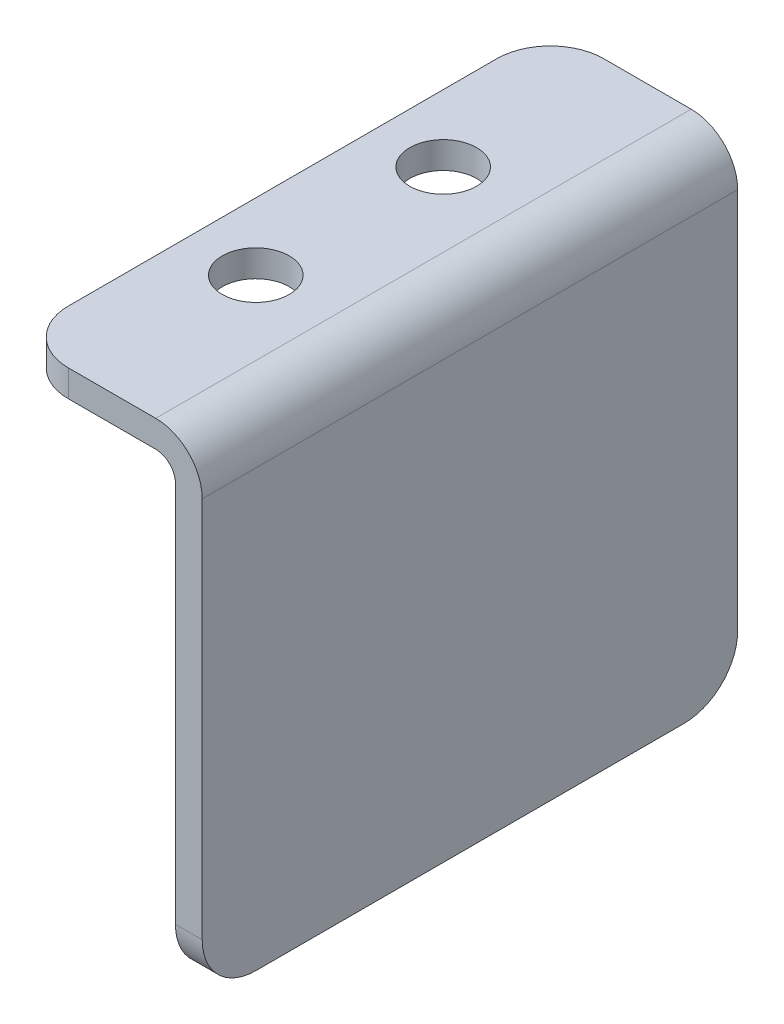
ISO-10303-21;
HEADER;
FILE_DESCRIPTION(('STEP AP214'),'2;1');
FILE_NAME('part.step','',(''),(''),'','','');
FILE_SCHEMA(('AUTOMOTIVE_DESIGN { 1 0 10303 214 1 1 1 1 }'));
ENDSEC;
DATA;
#1=APPLICATION_CONTEXT('core data for automotive mechanical design processes');
#2=APPLICATION_PROTOCOL_DEFINITION('international standard','automotive_design',2000,#1);
#3=PRODUCT_CONTEXT('',#1,'mechanical');
#4=PRODUCT('Part','Part','',(#3));
#5=PRODUCT_RELATED_PRODUCT_CATEGORY('part','',(#4));
#6=PRODUCT_DEFINITION_FORMATION('','',#4);
#7=PRODUCT_DEFINITION_CONTEXT('part definition',#1,'design');
#8=PRODUCT_DEFINITION('design','',#6,#7);
#9=PRODUCT_DEFINITION_SHAPE('','',#8);
#10=(LENGTH_UNIT() NAMED_UNIT(*) SI_UNIT(.MILLI.,.METRE.));
#11=(NAMED_UNIT(*) PLANE_ANGLE_UNIT() SI_UNIT($,.RADIAN.));
#12=(NAMED_UNIT(*) SI_UNIT($,.STERADIAN.) SOLID_ANGLE_UNIT());
#13=UNCERTAINTY_MEASURE_WITH_UNIT(LENGTH_MEASURE(1.E-05),#10,'distance_accuracy_value','');
#14=(GEOMETRIC_REPRESENTATION_CONTEXT(3) GLOBAL_UNCERTAINTY_ASSIGNED_CONTEXT((#13)) GLOBAL_UNIT_ASSIGNED_CONTEXT((#10,
#11,#12)) REPRESENTATION_CONTEXT('',''));
#15=CARTESIAN_POINT('',(0.,0.,0.));
#16=DIRECTION('',(0.,0.,1.));
#17=DIRECTION('',(1.,0.,0.));
#18=AXIS2_PLACEMENT_3D('',#15,#16,#17);
#19=CARTESIAN_POINT('',(2.,1.,-2.));
#20=DIRECTION('',(0.,-1.,0.));
#21=DIRECTION('',(0.,0.,-1.));
#22=AXIS2_PLACEMENT_3D('',#19,#20,#21);
#23=CYLINDRICAL_SURFACE('',#22,2.);
#24=CARTESIAN_POINT('',(2.,1.,-2.));
#25=DIRECTION('',(0.,-1.,0.));
#26=DIRECTION('',(0.,0.,-1.));
#27=AXIS2_PLACEMENT_3D('',#24,#25,#26);
#28=CIRCLE('',#27,2.);
#29=CARTESIAN_POINT('',(2.,1.,0.));
#30=VERTEX_POINT('',#29);
#31=CARTESIAN_POINT('',(0.,1.,-2.));
#32=VERTEX_POINT('',#31);
#33=EDGE_CURVE('E20',#30,#32,#28,.T.);
#34=ORIENTED_EDGE('',*,*,#33,.T.);
#35=DIRECTION('',(0.,-1.,0.));
#36=VECTOR('',#35,1.);
#37=CARTESIAN_POINT('',(0.,1.,-2.));
#38=LINE('',#37,#36);
#39=CARTESIAN_POINT('',(0.,0.,-2.));
#40=VERTEX_POINT('',#39);
#41=EDGE_CURVE('E11',#32,#40,#38,.T.);
#42=ORIENTED_EDGE('',*,*,#41,.T.);
#43=CARTESIAN_POINT('',(2.,0.,-2.));
#44=DIRECTION('',(0.,-1.,0.));
#45=DIRECTION('',(0.,0.,-1.));
#46=AXIS2_PLACEMENT_3D('',#43,#44,#45);
#47=CIRCLE('',#46,2.);
#48=CARTESIAN_POINT('',(2.,0.,0.));
#49=VERTEX_POINT('',#48);
#50=EDGE_CURVE('E274',#49,#40,#47,.T.);
#51=ORIENTED_EDGE('',*,*,#50,.F.);
#52=DIRECTION('',(0.,1.,0.));
#53=VECTOR('',#52,1.);
#54=CARTESIAN_POINT('',(2.,1.,0.));
#55=LINE('',#54,#53);
#56=EDGE_CURVE('E250',#49,#30,#55,.T.);
#57=ORIENTED_EDGE('',*,*,#56,.T.);
#58=EDGE_LOOP('',(#34,#42,#51,#57));
#59=FACE_BOUND('',#58,.T.);
#60=ADVANCED_FACE('F17',(#59),#23,.T.);
#61=CARTESIAN_POINT('',(0.,1.,0.));
#62=DIRECTION('',(1.,0.,0.));
#63=DIRECTION('',(0.,1.,0.));
#64=AXIS2_PLACEMENT_3D('',#61,#62,#63);
#65=PLANE('',#64);
#66=DIRECTION('',(0.,0.,-1.));
#67=VECTOR('',#66,1.);
#68=CARTESIAN_POINT('',(0.,0.,-20.));
#69=LINE('',#68,#67);
#70=CARTESIAN_POINT('',(0.,0.,-18.));
#71=VERTEX_POINT('',#70);
#72=EDGE_CURVE('E278',#40,#71,#69,.T.);
#73=ORIENTED_EDGE('',*,*,#72,.F.);
#74=ORIENTED_EDGE('',*,*,#41,.F.);
#75=DIRECTION('',(0.,0.,-1.));
#76=VECTOR('',#75,1.);
#77=CARTESIAN_POINT('',(0.,1.,-20.));
#78=LINE('',#77,#76);
#79=CARTESIAN_POINT('',(0.,1.,-18.));
#80=VERTEX_POINT('',#79);
#81=EDGE_CURVE('E285',#32,#80,#78,.T.);
#82=ORIENTED_EDGE('',*,*,#81,.T.);
#83=DIRECTION('',(0.,1.,0.));
#84=VECTOR('',#83,1.);
#85=CARTESIAN_POINT('',(0.,1.,-18.));
#86=LINE('',#85,#84);
#87=EDGE_CURVE('E26',#71,#80,#86,.T.);
#88=ORIENTED_EDGE('',*,*,#87,.F.);
#89=EDGE_LOOP('',(#73,#74,#82,#88));
#90=FACE_BOUND('',#89,.T.);
#91=ADVANCED_FACE('F310',(#90),#65,.F.);
#92=CARTESIAN_POINT('',(2.,1.,-18.));
#93=DIRECTION('',(0.,-1.,0.));
#94=DIRECTION('',(0.,0.,-1.));
#95=AXIS2_PLACEMENT_3D('',#92,#93,#94);
#96=CYLINDRICAL_SURFACE('',#95,2.);
#97=CARTESIAN_POINT('',(2.,1.,-18.));
#98=DIRECTION('',(0.,-1.,0.));
#99=DIRECTION('',(0.,0.,-1.));
#100=AXIS2_PLACEMENT_3D('',#97,#98,#99);
#101=CIRCLE('',#100,2.);
#102=CARTESIAN_POINT('',(2.,1.,-20.));
#103=VERTEX_POINT('',#102);
#104=EDGE_CURVE('E269',#80,#103,#101,.T.);
#105=ORIENTED_EDGE('',*,*,#104,.T.);
#106=DIRECTION('',(0.,-1.,0.));
#107=VECTOR('',#106,1.);
#108=CARTESIAN_POINT('',(2.,1.,-20.));
#109=LINE('',#108,#107);
#110=CARTESIAN_POINT('',(2.,0.,-20.));
#111=VERTEX_POINT('',#110);
#112=EDGE_CURVE('E203',#103,#111,#109,.T.);
#113=ORIENTED_EDGE('',*,*,#112,.T.);
#114=CARTESIAN_POINT('',(2.,0.,-18.));
#115=DIRECTION('',(0.,-1.,0.));
#116=DIRECTION('',(0.,0.,-1.));
#117=AXIS2_PLACEMENT_3D('',#114,#115,#116);
#118=CIRCLE('',#117,2.);
#119=EDGE_CURVE('E282',#71,#111,#118,.T.);
#120=ORIENTED_EDGE('',*,*,#119,.F.);
#121=ORIENTED_EDGE('',*,*,#87,.T.);
#122=EDGE_LOOP('',(#105,#113,#120,#121));
#123=FACE_BOUND('',#122,.T.);
#124=ADVANCED_FACE('F301',(#123),#96,.T.);
#125=CARTESIAN_POINT('',(5.2634,-0.7366,0.));
#126=DIRECTION('',(0.,0.,1.));
#127=DIRECTION('',(1.,0.,0.));
#128=AXIS2_PLACEMENT_3D('',#125,#126,#127);
#129=CYLINDRICAL_SURFACE('',#128,0.7366);
#130=DIRECTION('',(0.,0.,-1.));
#131=VECTOR('',#130,1.);
#132=CARTESIAN_POINT('',(6.,-0.7366,0.));
#133=LINE('',#132,#131);
#134=CARTESIAN_POINT('',(6.,-0.7366,0.));
#135=VERTEX_POINT('',#134);
#136=CARTESIAN_POINT('',(6.,-0.7366,-20.));
#137=VERTEX_POINT('',#136);
#138=EDGE_CURVE('E265',#135,#137,#133,.T.);
#139=ORIENTED_EDGE('',*,*,#138,.F.);
#140=CARTESIAN_POINT('',(5.2634,-0.7366,0.));
#141=DIRECTION('',(0.,0.,-1.));
#142=DIRECTION('',(1.,0.,0.));
#143=AXIS2_PLACEMENT_3D('',#140,#141,#142);
#144=CIRCLE('',#143,0.7366);
#145=CARTESIAN_POINT('',(5.2634,0.,0.));
#146=VERTEX_POINT('',#145);
#147=EDGE_CURVE('E258',#146,#135,#144,.T.);
#148=ORIENTED_EDGE('',*,*,#147,.F.);
#149=DIRECTION('',(0.,0.,1.));
#150=VECTOR('',#149,1.);
#151=CARTESIAN_POINT('',(5.2634,0.,-20.));
#152=LINE('',#151,#150);
#153=CARTESIAN_POINT('',(5.2634,0.,-20.));
#154=VERTEX_POINT('',#153);
#155=EDGE_CURVE('E268',#154,#146,#152,.T.);
#156=ORIENTED_EDGE('',*,*,#155,.F.);
#157=CARTESIAN_POINT('',(5.2634,-0.7366,-20.));
#158=DIRECTION('',(0.,0.,1.));
#159=DIRECTION('',(1.,0.,0.));
#160=AXIS2_PLACEMENT_3D('',#157,#158,#159);
#161=CIRCLE('',#160,0.7366);
#162=EDGE_CURVE('E204',#137,#154,#161,.T.);
#163=ORIENTED_EDGE('',*,*,#162,.F.);
#164=EDGE_LOOP('',(#139,#148,#156,#163));
#165=FACE_BOUND('',#164,.T.);
#166=ADVANCED_FACE('F318',(#165),#129,.F.);
#167=CARTESIAN_POINT('',(0.,1.,-20.));
#168=DIRECTION('',(0.,-1.,0.));
#169=DIRECTION('',(0.,0.,-1.));
#170=AXIS2_PLACEMENT_3D('',#167,#168,#169);
#171=PLANE('',#170);
#172=CARTESIAN_POINT('',(2.5,1.,-13.5));
#173=DIRECTION('',(0.,1.,0.));
#174=DIRECTION('',(0.,0.,1.));
#175=AXIS2_PLACEMENT_3D('',#172,#173,#174);
#176=CIRCLE('',#175,1.25);
#177=CARTESIAN_POINT('',(2.5,1.,-12.25));
#178=VERTEX_POINT('',#177);
#179=EDGE_CURVE('E174',#178,#178,#176,.T.);
#180=ORIENTED_EDGE('',*,*,#179,.F.);
#181=EDGE_LOOP('',(#180));
#182=FACE_BOUND('',#181,.T.);
#183=CARTESIAN_POINT('',(2.5,1.,-6.5));
#184=DIRECTION('',(0.,1.,0.));
#185=DIRECTION('',(0.,0.,1.));
#186=AXIS2_PLACEMENT_3D('',#183,#184,#185);
#187=CIRCLE('',#186,1.25);
#188=CARTESIAN_POINT('',(2.5,1.,-5.25));
#189=VERTEX_POINT('',#188);
#190=EDGE_CURVE('E188',#189,#189,#187,.T.);
#191=ORIENTED_EDGE('',*,*,#190,.F.);
#192=EDGE_LOOP('',(#191));
#193=FACE_BOUND('',#192,.T.);
#194=ORIENTED_EDGE('',*,*,#81,.F.);
#195=ORIENTED_EDGE('',*,*,#33,.F.);
#196=DIRECTION('',(1.,0.,0.));
#197=VECTOR('',#196,1.);
#198=CARTESIAN_POINT('',(7.,1.,0.));
#199=LINE('',#198,#197);
#200=CARTESIAN_POINT('',(5.2634,1.,0.));
#201=VERTEX_POINT('',#200);
#202=EDGE_CURVE('E247',#30,#201,#199,.T.);
#203=ORIENTED_EDGE('',*,*,#202,.T.);
#204=DIRECTION('',(0.,0.,1.));
#205=VECTOR('',#204,1.);
#206=CARTESIAN_POINT('',(5.2634,1.,0.));
#207=LINE('',#206,#205);
#208=CARTESIAN_POINT('',(5.2634,1.,-20.));
#209=VERTEX_POINT('',#208);
#210=EDGE_CURVE('E240',#209,#201,#207,.T.);
#211=ORIENTED_EDGE('',*,*,#210,.F.);
#212=DIRECTION('',(-1.,0.,0.));
#213=VECTOR('',#212,1.);
#214=CARTESIAN_POINT('',(7.,1.,-20.));
#215=LINE('',#214,#213);
#216=EDGE_CURVE('E232',#209,#103,#215,.T.);
#217=ORIENTED_EDGE('',*,*,#216,.T.);
#218=ORIENTED_EDGE('',*,*,#104,.F.);
#219=EDGE_LOOP('',(#194,#195,#203,#211,#217,#218));
#220=FACE_BOUND('',#219,.T.);
#221=ADVANCED_FACE('F298',(#182,#193,#220),#171,.F.);
#222=CARTESIAN_POINT('',(0.,0.,-20.));
#223=DIRECTION('',(0.,-1.,0.));
#224=DIRECTION('',(0.,0.,-1.));
#225=AXIS2_PLACEMENT_3D('',#222,#223,#224);
#226=PLANE('',#225);
#227=CARTESIAN_POINT('',(2.5,0.,-13.5));
#228=DIRECTION('',(0.,1.,0.));
#229=DIRECTION('',(0.,0.,1.));
#230=AXIS2_PLACEMENT_3D('',#227,#228,#229);
#231=CIRCLE('',#230,1.25);
#232=CARTESIAN_POINT('',(2.5,0.,-12.25));
#233=VERTEX_POINT('',#232);
#234=EDGE_CURVE('E178',#233,#233,#231,.T.);
#235=ORIENTED_EDGE('',*,*,#234,.T.);
#236=EDGE_LOOP('',(#235));
#237=FACE_BOUND('',#236,.T.);
#238=CARTESIAN_POINT('',(2.5,0.,-6.5));
#239=DIRECTION('',(0.,1.,0.));
#240=DIRECTION('',(0.,0.,1.));
#241=AXIS2_PLACEMENT_3D('',#238,#239,#240);
#242=CIRCLE('',#241,1.25);
#243=CARTESIAN_POINT('',(2.5,0.,-5.25));
#244=VERTEX_POINT('',#243);
#245=EDGE_CURVE('E185',#244,#244,#242,.T.);
#246=ORIENTED_EDGE('',*,*,#245,.T.);
#247=EDGE_LOOP('',(#246));
#248=FACE_BOUND('',#247,.T.);
#249=DIRECTION('',(1.,0.,0.));
#250=VECTOR('',#249,1.);
#251=CARTESIAN_POINT('',(7.,0.,-20.));
#252=LINE('',#251,#250);
#253=EDGE_CURVE('E199',#111,#154,#252,.T.);
#254=ORIENTED_EDGE('',*,*,#253,.T.);
#255=ORIENTED_EDGE('',*,*,#155,.T.);
#256=DIRECTION('',(-1.,0.,0.));
#257=VECTOR('',#256,1.);
#258=CARTESIAN_POINT('',(7.,0.,0.));
#259=LINE('',#258,#257);
#260=EDGE_CURVE('E254',#146,#49,#259,.T.);
#261=ORIENTED_EDGE('',*,*,#260,.T.);
#262=ORIENTED_EDGE('',*,*,#50,.T.);
#263=ORIENTED_EDGE('',*,*,#72,.T.);
#264=ORIENTED_EDGE('',*,*,#119,.T.);
#265=EDGE_LOOP('',(#254,#255,#261,#262,#263,#264));
#266=FACE_BOUND('',#265,.T.);
#267=ADVANCED_FACE('F308',(#237,#248,#266),#226,.T.);
#268=CARTESIAN_POINT('',(6.,0.,0.));
#269=DIRECTION('',(-1.,0.,0.));
#270=DIRECTION('',(0.,1.,0.));
#271=AXIS2_PLACEMENT_3D('',#268,#269,#270);
#272=PLANE('',#271);
#273=DIRECTION('',(0.,1.,0.));
#274=VECTOR('',#273,1.);
#275=CARTESIAN_POINT('',(6.,-17.,0.));
#276=LINE('',#275,#274);
#277=CARTESIAN_POINT('',(6.,-15.,0.));
#278=VERTEX_POINT('',#277);
#279=EDGE_CURVE('E262',#278,#135,#276,.T.);
#280=ORIENTED_EDGE('',*,*,#279,.T.);
#281=ORIENTED_EDGE('',*,*,#138,.T.);
#282=DIRECTION('',(0.,-1.,0.));
#283=VECTOR('',#282,1.);
#284=CARTESIAN_POINT('',(6.,0.,-20.));
#285=LINE('',#284,#283);
#286=CARTESIAN_POINT('',(6.,-15.,-20.));
#287=VERTEX_POINT('',#286);
#288=EDGE_CURVE('E218',#137,#287,#285,.T.);
#289=ORIENTED_EDGE('',*,*,#288,.T.);
#290=CARTESIAN_POINT('',(6.,-15.,-18.));
#291=DIRECTION('',(1.,0.,0.));
#292=DIRECTION('',(0.,-1.,0.));
#293=AXIS2_PLACEMENT_3D('',#290,#291,#292);
#294=CIRCLE('',#293,2.);
#295=CARTESIAN_POINT('',(6.,-17.,-18.));
#296=VERTEX_POINT('',#295);
#297=EDGE_CURVE('E147',#296,#287,#294,.T.);
#298=ORIENTED_EDGE('',*,*,#297,.F.);
#299=DIRECTION('',(0.,0.,1.));
#300=VECTOR('',#299,1.);
#301=CARTESIAN_POINT('',(6.,-17.,-20.));
#302=LINE('',#301,#300);
#303=CARTESIAN_POINT('',(6.,-17.,-2.));
#304=VERTEX_POINT('',#303);
#305=EDGE_CURVE('E139',#296,#304,#302,.T.);
#306=ORIENTED_EDGE('',*,*,#305,.T.);
#307=CARTESIAN_POINT('',(6.,-15.,-2.));
#308=DIRECTION('',(1.,0.,0.));
#309=DIRECTION('',(0.,-1.,0.));
#310=AXIS2_PLACEMENT_3D('',#307,#308,#309);
#311=CIRCLE('',#310,2.);
#312=EDGE_CURVE('E144',#278,#304,#311,.T.);
#313=ORIENTED_EDGE('',*,*,#312,.F.);
#314=EDGE_LOOP('',(#280,#281,#289,#298,#306,#313));
#315=FACE_BOUND('',#314,.T.);
#316=ADVANCED_FACE('F142',(#315),#272,.T.);
#317=CARTESIAN_POINT('',(7.,-17.,0.));
#318=DIRECTION('',(0.,0.,-1.));
#319=DIRECTION('',(0.,-1.,0.));
#320=AXIS2_PLACEMENT_3D('',#317,#318,#319);
#321=PLANE('',#320);
#322=DIRECTION('',(0.,1.,0.));
#323=VECTOR('',#322,1.);
#324=CARTESIAN_POINT('',(7.,0.,0.));
#325=LINE('',#324,#323);
#326=CARTESIAN_POINT('',(7.,-15.,0.));
#327=VERTEX_POINT('',#326);
#328=CARTESIAN_POINT('',(7.,-0.7366,0.));
#329=VERTEX_POINT('',#328);
#330=EDGE_CURVE('E195',#327,#329,#325,.T.);
#331=ORIENTED_EDGE('',*,*,#330,.T.);
#332=CARTESIAN_POINT('',(5.2634,-0.7366,0.));
#333=DIRECTION('',(0.,0.,-1.));
#334=DIRECTION('',(1.,0.,0.));
#335=AXIS2_PLACEMENT_3D('',#332,#333,#334);
#336=CIRCLE('',#335,1.7366);
#337=EDGE_CURVE('E244',#201,#329,#336,.T.);
#338=ORIENTED_EDGE('',*,*,#337,.F.);
#339=ORIENTED_EDGE('',*,*,#202,.F.);
#340=ORIENTED_EDGE('',*,*,#56,.F.);
#341=ORIENTED_EDGE('',*,*,#260,.F.);
#342=ORIENTED_EDGE('',*,*,#147,.T.);
#343=ORIENTED_EDGE('',*,*,#279,.F.);
#344=DIRECTION('',(-1.,0.,0.));
#345=VECTOR('',#344,1.);
#346=CARTESIAN_POINT('',(7.,-15.,0.));
#347=LINE('',#346,#345);
#348=EDGE_CURVE('E164',#327,#278,#347,.T.);
#349=ORIENTED_EDGE('',*,*,#348,.F.);
#350=EDGE_LOOP('',(#331,#338,#339,#340,#341,#342,#343,#349));
#351=FACE_BOUND('',#350,.T.);
#352=ADVANCED_FACE('F333',(#351),#321,.F.);
#353=CARTESIAN_POINT('',(5.2634,-0.7366,0.));
#354=DIRECTION('',(0.,0.,1.));
#355=DIRECTION('',(1.,0.,0.));
#356=AXIS2_PLACEMENT_3D('',#353,#354,#355);
#357=CYLINDRICAL_SURFACE('',#356,1.7366);
#358=ORIENTED_EDGE('',*,*,#210,.T.);
#359=ORIENTED_EDGE('',*,*,#337,.T.);
#360=DIRECTION('',(0.,0.,-1.));
#361=VECTOR('',#360,1.);
#362=CARTESIAN_POINT('',(7.,-0.7366,0.));
#363=LINE('',#362,#361);
#364=CARTESIAN_POINT('',(7.,-0.7366,-20.));
#365=VERTEX_POINT('',#364);
#366=EDGE_CURVE('E183',#329,#365,#363,.T.);
#367=ORIENTED_EDGE('',*,*,#366,.T.);
#368=CARTESIAN_POINT('',(5.2634,-0.7366,-20.));
#369=DIRECTION('',(0.,0.,1.));
#370=DIRECTION('',(1.,0.,0.));
#371=AXIS2_PLACEMENT_3D('',#368,#369,#370);
#372=CIRCLE('',#371,1.7366);
#373=EDGE_CURVE('E236',#365,#209,#372,.T.);
#374=ORIENTED_EDGE('',*,*,#373,.T.);
#375=EDGE_LOOP('',(#358,#359,#367,#374));
#376=FACE_BOUND('',#375,.T.);
#377=ADVANCED_FACE('F330',(#376),#357,.T.);
#378=CARTESIAN_POINT('',(7.,0.,-20.));
#379=DIRECTION('',(0.,0.,1.));
#380=DIRECTION('',(1.,0.,0.));
#381=AXIS2_PLACEMENT_3D('',#378,#379,#380);
#382=PLANE('',#381);
#383=ORIENTED_EDGE('',*,*,#288,.F.);
#384=ORIENTED_EDGE('',*,*,#162,.T.);
#385=ORIENTED_EDGE('',*,*,#253,.F.);
#386=ORIENTED_EDGE('',*,*,#112,.F.);
#387=ORIENTED_EDGE('',*,*,#216,.F.);
#388=ORIENTED_EDGE('',*,*,#373,.F.);
#389=DIRECTION('',(0.,-1.,0.));
#390=VECTOR('',#389,1.);
#391=CARTESIAN_POINT('',(7.,0.,-20.));
#392=LINE('',#391,#390);
#393=CARTESIAN_POINT('',(7.,-15.,-20.));
#394=VERTEX_POINT('',#393);
#395=EDGE_CURVE('E179',#365,#394,#392,.T.);
#396=ORIENTED_EDGE('',*,*,#395,.T.);
#397=DIRECTION('',(1.,0.,0.));
#398=VECTOR('',#397,1.);
#399=CARTESIAN_POINT('',(7.,-15.,-20.));
#400=LINE('',#399,#398);
#401=EDGE_CURVE('E192',#287,#394,#400,.T.);
#402=ORIENTED_EDGE('',*,*,#401,.F.);
#403=EDGE_LOOP('',(#383,#384,#385,#386,#387,#388,#396,#402));
#404=FACE_BOUND('',#403,.T.);
#405=ADVANCED_FACE('F305',(#404),#382,.F.);
#406=CARTESIAN_POINT('',(7.,-15.,-18.));
#407=DIRECTION('',(-1.,0.,0.));
#408=DIRECTION('',(0.,-1.,0.));
#409=AXIS2_PLACEMENT_3D('',#406,#407,#408);
#410=CYLINDRICAL_SURFACE('',#409,2.);
#411=CARTESIAN_POINT('',(7.,-15.,-18.));
#412=DIRECTION('',(-1.,0.,0.));
#413=DIRECTION('',(0.,-1.,0.));
#414=AXIS2_PLACEMENT_3D('',#411,#412,#413);
#415=CIRCLE('',#414,2.);
#416=CARTESIAN_POINT('',(7.,-17.,-18.));
#417=VERTEX_POINT('',#416);
#418=EDGE_CURVE('E184',#394,#417,#415,.T.);
#419=ORIENTED_EDGE('',*,*,#418,.T.);
#420=DIRECTION('',(-1.,0.,0.));
#421=VECTOR('',#420,1.);
#422=CARTESIAN_POINT('',(7.,-17.,-18.));
#423=LINE('',#422,#421);
#424=EDGE_CURVE('E151',#417,#296,#423,.T.);
#425=ORIENTED_EDGE('',*,*,#424,.T.);
#426=ORIENTED_EDGE('',*,*,#297,.T.);
#427=ORIENTED_EDGE('',*,*,#401,.T.);
#428=EDGE_LOOP('',(#419,#425,#426,#427));
#429=FACE_BOUND('',#428,.T.);
#430=ADVANCED_FACE('F337',(#429),#410,.T.);
#431=CARTESIAN_POINT('',(7.,-17.,-20.));
#432=DIRECTION('',(0.,1.,0.));
#433=DIRECTION('',(1.,0.,0.));
#434=AXIS2_PLACEMENT_3D('',#431,#432,#433);
#435=PLANE('',#434);
#436=ORIENTED_EDGE('',*,*,#305,.F.);
#437=ORIENTED_EDGE('',*,*,#424,.F.);
#438=DIRECTION('',(0.,0.,1.));
#439=VECTOR('',#438,1.);
#440=CARTESIAN_POINT('',(7.,-17.,0.));
#441=LINE('',#440,#439);
#442=CARTESIAN_POINT('',(7.,-17.,-2.));
#443=VERTEX_POINT('',#442);
#444=EDGE_CURVE('E157',#417,#443,#441,.T.);
#445=ORIENTED_EDGE('',*,*,#444,.T.);
#446=DIRECTION('',(1.,0.,0.));
#447=VECTOR('',#446,1.);
#448=CARTESIAN_POINT('',(7.,-17.,-2.));
#449=LINE('',#448,#447);
#450=EDGE_CURVE('E152',#304,#443,#449,.T.);
#451=ORIENTED_EDGE('',*,*,#450,.F.);
#452=EDGE_LOOP('',(#436,#437,#445,#451));
#453=FACE_BOUND('',#452,.T.);
#454=ADVANCED_FACE('F155',(#453),#435,.F.);
#455=CARTESIAN_POINT('',(7.,-15.,-2.));
#456=DIRECTION('',(-1.,0.,0.));
#457=DIRECTION('',(0.,-1.,0.));
#458=AXIS2_PLACEMENT_3D('',#455,#456,#457);
#459=CYLINDRICAL_SURFACE('',#458,2.);
#460=CARTESIAN_POINT('',(7.,-15.,-2.));
#461=DIRECTION('',(-1.,0.,0.));
#462=DIRECTION('',(0.,-1.,0.));
#463=AXIS2_PLACEMENT_3D('',#460,#461,#462);
#464=CIRCLE('',#463,2.);
#465=EDGE_CURVE('E171',#443,#327,#464,.T.);
#466=ORIENTED_EDGE('',*,*,#465,.T.);
#467=ORIENTED_EDGE('',*,*,#348,.T.);
#468=ORIENTED_EDGE('',*,*,#312,.T.);
#469=ORIENTED_EDGE('',*,*,#450,.T.);
#470=EDGE_LOOP('',(#466,#467,#468,#469));
#471=FACE_BOUND('',#470,.T.);
#472=ADVANCED_FACE('F163',(#471),#459,.T.);
#473=CARTESIAN_POINT('',(7.,0.,0.));
#474=DIRECTION('',(-1.,0.,0.));
#475=DIRECTION('',(0.,1.,0.));
#476=AXIS2_PLACEMENT_3D('',#473,#474,#475);
#477=PLANE('',#476);
#478=ORIENTED_EDGE('',*,*,#444,.F.);
#479=ORIENTED_EDGE('',*,*,#418,.F.);
#480=ORIENTED_EDGE('',*,*,#395,.F.);
#481=ORIENTED_EDGE('',*,*,#366,.F.);
#482=ORIENTED_EDGE('',*,*,#330,.F.);
#483=ORIENTED_EDGE('',*,*,#465,.F.);
#484=EDGE_LOOP('',(#478,#479,#480,#481,#482,#483));
#485=FACE_BOUND('',#484,.T.);
#486=ADVANCED_FACE('F324',(#485),#477,.F.);
#487=CARTESIAN_POINT('',(2.5,1.,-13.5));
#488=DIRECTION('',(0.,1.,0.));
#489=DIRECTION('',(0.,0.,1.));
#490=AXIS2_PLACEMENT_3D('',#487,#488,#489);
#491=CYLINDRICAL_SURFACE('',#490,1.25);
#492=ORIENTED_EDGE('',*,*,#179,.T.);
#493=EDGE_LOOP('',(#492));
#494=FACE_BOUND('',#493,.T.);
#495=ORIENTED_EDGE('',*,*,#234,.F.);
#496=EDGE_LOOP('',(#495));
#497=FACE_BOUND('',#496,.T.);
#498=ADVANCED_FACE('F322',(#494,#497),#491,.F.);
#499=CARTESIAN_POINT('',(2.5,1.,-6.5));
#500=DIRECTION('',(0.,1.,0.));
#501=DIRECTION('',(0.,0.,1.));
#502=AXIS2_PLACEMENT_3D('',#499,#500,#501);
#503=CYLINDRICAL_SURFACE('',#502,1.25);
#504=ORIENTED_EDGE('',*,*,#190,.T.);
#505=EDGE_LOOP('',(#504));
#506=FACE_BOUND('',#505,.T.);
#507=ORIENTED_EDGE('',*,*,#245,.F.);
#508=EDGE_LOOP('',(#507));
#509=FACE_BOUND('',#508,.T.);
#510=ADVANCED_FACE('F426',(#506,#509),#503,.F.);
#511=CLOSED_SHELL('',(#60,#91,#124,#166,#221,#267,#316,#352,#377,#405,#430,#454,#472,#486,#498,#510));
#512=MANIFOLD_SOLID_BREP('B1',#511);
#513=ADVANCED_BREP_SHAPE_REPRESENTATION('',(#18,#512),#14);
#514=SHAPE_DEFINITION_REPRESENTATION(#9,#513);
ENDSEC;
END-ISO-10303-21;
